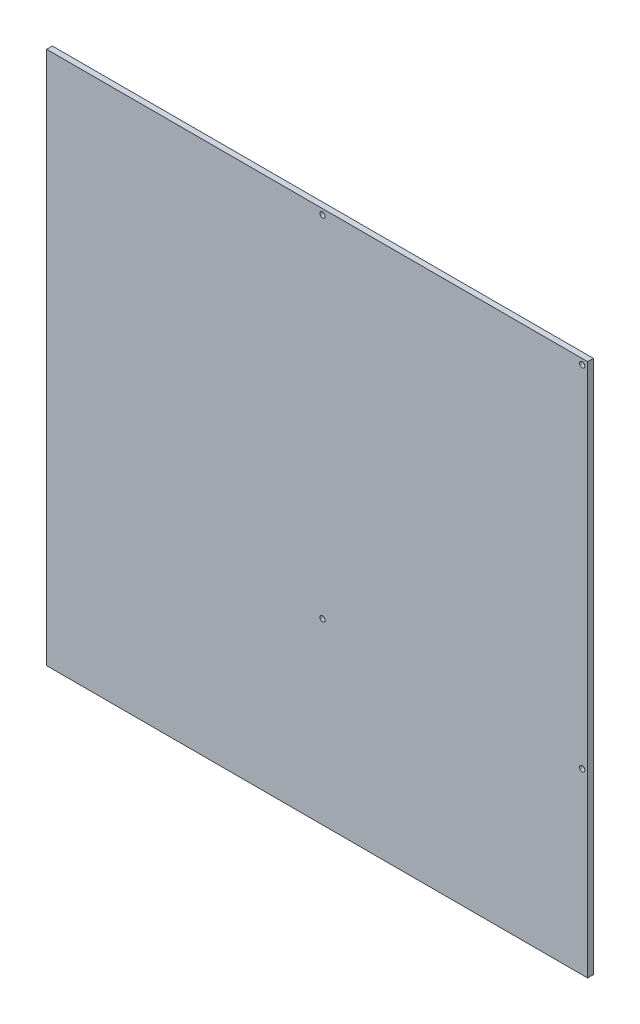
ISO-10303-21;
HEADER;
FILE_DESCRIPTION(('STEP AP214'),'2;1');
FILE_NAME('part.step','',(''),(''),'','','');
FILE_SCHEMA(('AUTOMOTIVE_DESIGN { 1 0 10303 214 1 1 1 1 }'));
ENDSEC;
DATA;
#1=APPLICATION_CONTEXT('core data for automotive mechanical design processes');
#2=APPLICATION_PROTOCOL_DEFINITION('international standard','automotive_design',2000,#1);
#3=PRODUCT_CONTEXT('',#1,'mechanical');
#4=PRODUCT('Part','Part','',(#3));
#5=PRODUCT_RELATED_PRODUCT_CATEGORY('part','',(#4));
#6=PRODUCT_DEFINITION_FORMATION('','',#4);
#7=PRODUCT_DEFINITION_CONTEXT('part definition',#1,'design');
#8=PRODUCT_DEFINITION('design','',#6,#7);
#9=PRODUCT_DEFINITION_SHAPE('','',#8);
#10=(LENGTH_UNIT() NAMED_UNIT(*) SI_UNIT(.MILLI.,.METRE.));
#11=(NAMED_UNIT(*) PLANE_ANGLE_UNIT() SI_UNIT($,.RADIAN.));
#12=(NAMED_UNIT(*) SI_UNIT($,.STERADIAN.) SOLID_ANGLE_UNIT());
#13=UNCERTAINTY_MEASURE_WITH_UNIT(LENGTH_MEASURE(1.E-05),#10,'distance_accuracy_value','');
#14=(GEOMETRIC_REPRESENTATION_CONTEXT(3) GLOBAL_UNCERTAINTY_ASSIGNED_CONTEXT((#13)) GLOBAL_UNIT_ASSIGNED_CONTEXT((#10,
#11,#12)) REPRESENTATION_CONTEXT('',''));
#15=CARTESIAN_POINT('',(0.,0.,0.));
#16=DIRECTION('',(0.,0.,1.));
#17=DIRECTION('',(1.,0.,0.));
#18=AXIS2_PLACEMENT_3D('',#15,#16,#17);
#19=CARTESIAN_POINT('',(-150.,148.,3.18));
#20=DIRECTION('',(1.,0.,0.));
#21=DIRECTION('',(0.,1.,0.));
#22=AXIS2_PLACEMENT_3D('',#19,#20,#21);
#23=PLANE('',#22);
#24=DIRECTION('',(0.,-1.,0.));
#25=VECTOR('',#24,1.);
#26=CARTESIAN_POINT('',(-150.,148.,0.));
#27=LINE('',#26,#25);
#28=CARTESIAN_POINT('',(-150.,148.,0.));
#29=VERTEX_POINT('',#28);
#30=CARTESIAN_POINT('',(-150.,-148.,0.));
#31=VERTEX_POINT('',#30);
#32=EDGE_CURVE('E107',#29,#31,#27,.T.);
#33=ORIENTED_EDGE('',*,*,#32,.T.);
#34=DIRECTION('',(0.,0.,-1.));
#35=VECTOR('',#34,1.);
#36=CARTESIAN_POINT('',(-150.,-148.,3.18));
#37=LINE('',#36,#35);
#38=CARTESIAN_POINT('',(-150.,-148.,3.18));
#39=VERTEX_POINT('',#38);
#40=EDGE_CURVE('E11',#39,#31,#37,.T.);
#41=ORIENTED_EDGE('',*,*,#40,.F.);
#42=DIRECTION('',(0.,-1.,0.));
#43=VECTOR('',#42,1.);
#44=CARTESIAN_POINT('',(-150.,148.,3.18));
#45=LINE('',#44,#43);
#46=CARTESIAN_POINT('',(-150.,148.,3.18));
#47=VERTEX_POINT('',#46);
#48=EDGE_CURVE('E91',#47,#39,#45,.T.);
#49=ORIENTED_EDGE('',*,*,#48,.F.);
#50=DIRECTION('',(0.,0.,-1.));
#51=VECTOR('',#50,1.);
#52=CARTESIAN_POINT('',(-150.,148.,3.18));
#53=LINE('',#52,#51);
#54=EDGE_CURVE('E103',#47,#29,#53,.T.);
#55=ORIENTED_EDGE('',*,*,#54,.T.);
#56=EDGE_LOOP('',(#33,#41,#49,#55));
#57=FACE_BOUND('',#56,.T.);
#58=ADVANCED_FACE('F39',(#57),#23,.F.);
#59=CARTESIAN_POINT('',(150.,-148.,3.18));
#60=DIRECTION('',(0.,1.,0.));
#61=DIRECTION('',(-1.,0.,0.));
#62=AXIS2_PLACEMENT_3D('',#59,#60,#61);
#63=PLANE('',#62);
#64=DIRECTION('',(1.,0.,0.));
#65=VECTOR('',#64,1.);
#66=CARTESIAN_POINT('',(150.,-148.,0.));
#67=LINE('',#66,#65);
#68=CARTESIAN_POINT('',(150.,-148.,0.));
#69=VERTEX_POINT('',#68);
#70=EDGE_CURVE('E96',#31,#69,#67,.T.);
#71=ORIENTED_EDGE('',*,*,#70,.T.);
#72=DIRECTION('',(0.,0.,-1.));
#73=VECTOR('',#72,1.);
#74=CARTESIAN_POINT('',(150.,-148.,3.18));
#75=LINE('',#74,#73);
#76=CARTESIAN_POINT('',(150.,-148.,3.18));
#77=VERTEX_POINT('',#76);
#78=EDGE_CURVE('E48',#77,#69,#75,.T.);
#79=ORIENTED_EDGE('',*,*,#78,.F.);
#80=DIRECTION('',(1.,0.,0.));
#81=VECTOR('',#80,1.);
#82=CARTESIAN_POINT('',(150.,-148.,3.18));
#83=LINE('',#82,#81);
#84=EDGE_CURVE('E86',#39,#77,#83,.T.);
#85=ORIENTED_EDGE('',*,*,#84,.F.);
#86=ORIENTED_EDGE('',*,*,#40,.T.);
#87=EDGE_LOOP('',(#71,#79,#85,#86));
#88=FACE_BOUND('',#87,.T.);
#89=ADVANCED_FACE('F95',(#88),#63,.F.);
#90=CARTESIAN_POINT('',(150.,148.,3.18));
#91=DIRECTION('',(-1.,0.,0.));
#92=DIRECTION('',(0.,-1.,0.));
#93=AXIS2_PLACEMENT_3D('',#90,#91,#92);
#94=PLANE('',#93);
#95=DIRECTION('',(0.,1.,0.));
#96=VECTOR('',#95,1.);
#97=CARTESIAN_POINT('',(150.,148.,0.));
#98=LINE('',#97,#96);
#99=CARTESIAN_POINT('',(150.,148.,0.));
#100=VERTEX_POINT('',#99);
#101=EDGE_CURVE('E73',#69,#100,#98,.T.);
#102=ORIENTED_EDGE('',*,*,#101,.T.);
#103=DIRECTION('',(0.,0.,-1.));
#104=VECTOR('',#103,1.);
#105=CARTESIAN_POINT('',(150.,148.,3.18));
#106=LINE('',#105,#104);
#107=CARTESIAN_POINT('',(150.,148.,3.18));
#108=VERTEX_POINT('',#107);
#109=EDGE_CURVE('E98',#108,#100,#106,.T.);
#110=ORIENTED_EDGE('',*,*,#109,.F.);
#111=DIRECTION('',(0.,1.,0.));
#112=VECTOR('',#111,1.);
#113=CARTESIAN_POINT('',(150.,148.,3.18));
#114=LINE('',#113,#112);
#115=EDGE_CURVE('E89',#77,#108,#114,.T.);
#116=ORIENTED_EDGE('',*,*,#115,.F.);
#117=ORIENTED_EDGE('',*,*,#78,.T.);
#118=EDGE_LOOP('',(#102,#110,#116,#117));
#119=FACE_BOUND('',#118,.T.);
#120=ADVANCED_FACE('F99',(#119),#94,.F.);
#121=CARTESIAN_POINT('',(150.,148.,3.18));
#122=DIRECTION('',(0.,-1.,0.));
#123=DIRECTION('',(1.,0.,0.));
#124=AXIS2_PLACEMENT_3D('',#121,#122,#123);
#125=PLANE('',#124);
#126=DIRECTION('',(-1.,0.,0.));
#127=VECTOR('',#126,1.);
#128=CARTESIAN_POINT('',(150.,148.,0.));
#129=LINE('',#128,#127);
#130=EDGE_CURVE('E79',#100,#29,#129,.T.);
#131=ORIENTED_EDGE('',*,*,#130,.T.);
#132=ORIENTED_EDGE('',*,*,#54,.F.);
#133=DIRECTION('',(-1.,0.,0.));
#134=VECTOR('',#133,1.);
#135=CARTESIAN_POINT('',(150.,148.,3.18));
#136=LINE('',#135,#134);
#137=EDGE_CURVE('E56',#108,#47,#136,.T.);
#138=ORIENTED_EDGE('',*,*,#137,.F.);
#139=ORIENTED_EDGE('',*,*,#109,.T.);
#140=EDGE_LOOP('',(#131,#132,#138,#139));
#141=FACE_BOUND('',#140,.T.);
#142=ADVANCED_FACE('F121',(#141),#125,.F.);
#143=CARTESIAN_POINT('',(0.,0.,3.18));
#144=DIRECTION('',(0.,0.,-1.));
#145=DIRECTION('',(-1.,0.,0.));
#146=AXIS2_PLACEMENT_3D('',#143,#144,#145);
#147=PLANE('',#146);
#148=CARTESIAN_POINT('',(3.00000000000003,145.,3.18));
#149=DIRECTION('',(0.,0.,1.));
#150=DIRECTION('',(1.,0.,0.));
#151=AXIS2_PLACEMENT_3D('',#148,#149,#150);
#152=CIRCLE('',#151,1.47000000000003);
#153=CARTESIAN_POINT('',(4.47000000000006,145.,3.18));
#154=VERTEX_POINT('',#153);
#155=EDGE_CURVE('E136',#154,#154,#152,.T.);
#156=ORIENTED_EDGE('',*,*,#155,.F.);
#157=EDGE_LOOP('',(#156));
#158=FACE_BOUND('',#157,.T.);
#159=CARTESIAN_POINT('',(3.00000000000003,-49.,3.18));
#160=DIRECTION('',(0.,0.,1.));
#161=DIRECTION('',(1.,0.,0.));
#162=AXIS2_PLACEMENT_3D('',#159,#160,#161);
#163=CIRCLE('',#162,1.47000000000002);
#164=CARTESIAN_POINT('',(4.47000000000005,-49.,3.18));
#165=VERTEX_POINT('',#164);
#166=EDGE_CURVE('E144',#165,#165,#163,.T.);
#167=ORIENTED_EDGE('',*,*,#166,.F.);
#168=EDGE_LOOP('',(#167));
#169=FACE_BOUND('',#168,.T.);
#170=CARTESIAN_POINT('',(147.,-49.,3.18));
#171=DIRECTION('',(0.,0.,1.));
#172=DIRECTION('',(1.,0.,0.));
#173=AXIS2_PLACEMENT_3D('',#170,#171,#172);
#174=CIRCLE('',#173,1.46999999999999);
#175=CARTESIAN_POINT('',(148.47,-49.,3.18));
#176=VERTEX_POINT('',#175);
#177=EDGE_CURVE('E152',#176,#176,#174,.T.);
#178=ORIENTED_EDGE('',*,*,#177,.F.);
#179=EDGE_LOOP('',(#178));
#180=FACE_BOUND('',#179,.T.);
#181=CARTESIAN_POINT('',(147.,145.,3.18));
#182=DIRECTION('',(0.,0.,1.));
#183=DIRECTION('',(1.,0.,0.));
#184=AXIS2_PLACEMENT_3D('',#181,#182,#183);
#185=CIRCLE('',#184,1.47);
#186=CARTESIAN_POINT('',(148.47,145.,3.18));
#187=VERTEX_POINT('',#186);
#188=EDGE_CURVE('E128',#187,#187,#185,.T.);
#189=ORIENTED_EDGE('',*,*,#188,.F.);
#190=EDGE_LOOP('',(#189));
#191=FACE_BOUND('',#190,.T.);
#192=ORIENTED_EDGE('',*,*,#48,.T.);
#193=ORIENTED_EDGE('',*,*,#84,.T.);
#194=ORIENTED_EDGE('',*,*,#115,.T.);
#195=ORIENTED_EDGE('',*,*,#137,.T.);
#196=EDGE_LOOP('',(#192,#193,#194,#195));
#197=FACE_BOUND('',#196,.T.);
#198=ADVANCED_FACE('F87',(#158,#169,#180,#191,#197),#147,.F.);
#199=CARTESIAN_POINT('',(0.,0.,0.));
#200=DIRECTION('',(0.,0.,-1.));
#201=DIRECTION('',(-1.,0.,0.));
#202=AXIS2_PLACEMENT_3D('',#199,#200,#201);
#203=PLANE('',#202);
#204=CARTESIAN_POINT('',(3.00000000000003,145.,0.));
#205=DIRECTION('',(0.,0.,1.));
#206=DIRECTION('',(1.,0.,0.));
#207=AXIS2_PLACEMENT_3D('',#204,#205,#206);
#208=CIRCLE('',#207,1.47000000000003);
#209=CARTESIAN_POINT('',(4.47000000000006,145.,0.));
#210=VERTEX_POINT('',#209);
#211=EDGE_CURVE('E140',#210,#210,#208,.T.);
#212=ORIENTED_EDGE('',*,*,#211,.T.);
#213=EDGE_LOOP('',(#212));
#214=FACE_BOUND('',#213,.T.);
#215=CARTESIAN_POINT('',(3.00000000000003,-49.,0.));
#216=DIRECTION('',(0.,0.,1.));
#217=DIRECTION('',(1.,0.,0.));
#218=AXIS2_PLACEMENT_3D('',#215,#216,#217);
#219=CIRCLE('',#218,1.47000000000002);
#220=CARTESIAN_POINT('',(4.47000000000005,-49.,0.));
#221=VERTEX_POINT('',#220);
#222=EDGE_CURVE('E148',#221,#221,#219,.T.);
#223=ORIENTED_EDGE('',*,*,#222,.T.);
#224=EDGE_LOOP('',(#223));
#225=FACE_BOUND('',#224,.T.);
#226=CARTESIAN_POINT('',(147.,-49.,0.));
#227=DIRECTION('',(0.,0.,1.));
#228=DIRECTION('',(1.,0.,0.));
#229=AXIS2_PLACEMENT_3D('',#226,#227,#228);
#230=CIRCLE('',#229,1.46999999999999);
#231=CARTESIAN_POINT('',(148.47,-49.,0.));
#232=VERTEX_POINT('',#231);
#233=EDGE_CURVE('E132',#232,#232,#230,.T.);
#234=ORIENTED_EDGE('',*,*,#233,.T.);
#235=EDGE_LOOP('',(#234));
#236=FACE_BOUND('',#235,.T.);
#237=CARTESIAN_POINT('',(147.,145.,0.));
#238=DIRECTION('',(0.,0.,1.));
#239=DIRECTION('',(1.,0.,0.));
#240=AXIS2_PLACEMENT_3D('',#237,#238,#239);
#241=CIRCLE('',#240,1.47);
#242=CARTESIAN_POINT('',(148.47,145.,0.));
#243=VERTEX_POINT('',#242);
#244=EDGE_CURVE('E111',#243,#243,#241,.T.);
#245=ORIENTED_EDGE('',*,*,#244,.T.);
#246=EDGE_LOOP('',(#245));
#247=FACE_BOUND('',#246,.T.);
#248=ORIENTED_EDGE('',*,*,#32,.F.);
#249=ORIENTED_EDGE('',*,*,#130,.F.);
#250=ORIENTED_EDGE('',*,*,#101,.F.);
#251=ORIENTED_EDGE('',*,*,#70,.F.);
#252=EDGE_LOOP('',(#248,#249,#250,#251));
#253=FACE_BOUND('',#252,.T.);
#254=ADVANCED_FACE('F124',(#214,#225,#236,#247,#253),#203,.T.);
#255=CARTESIAN_POINT('',(147.,145.,0.));
#256=DIRECTION('',(0.,0.,1.));
#257=DIRECTION('',(1.,0.,0.));
#258=AXIS2_PLACEMENT_3D('',#255,#256,#257);
#259=CYLINDRICAL_SURFACE('',#258,1.47);
#260=CARTESIAN_POINT('',(148.47,145.,0.));
#261=CARTESIAN_POINT('',(148.47,145.,0.033125));
#262=CARTESIAN_POINT('',(148.47,145.,0.06625));
#263=CARTESIAN_POINT('',(148.47,145.,0.1325));
#264=CARTESIAN_POINT('',(148.47,145.,0.165625));
#265=CARTESIAN_POINT('',(148.47,145.,0.231875));
#266=CARTESIAN_POINT('',(148.47,145.,0.265));
#267=CARTESIAN_POINT('',(148.47,145.,0.33125));
#268=CARTESIAN_POINT('',(148.47,145.,0.364375));
#269=CARTESIAN_POINT('',(148.47,145.,0.430625));
#270=CARTESIAN_POINT('',(148.47,145.,0.46375));
#271=CARTESIAN_POINT('',(148.47,145.,0.53));
#272=CARTESIAN_POINT('',(148.47,145.,0.563125));
#273=CARTESIAN_POINT('',(148.47,145.,0.629375));
#274=CARTESIAN_POINT('',(148.47,145.,0.6625));
#275=CARTESIAN_POINT('',(148.47,145.,0.72875));
#276=CARTESIAN_POINT('',(148.47,145.,0.761875));
#277=CARTESIAN_POINT('',(148.47,145.,0.828125));
#278=CARTESIAN_POINT('',(148.47,145.,0.86125));
#279=CARTESIAN_POINT('',(148.47,145.,0.9275));
#280=CARTESIAN_POINT('',(148.47,145.,0.960625));
#281=CARTESIAN_POINT('',(148.47,145.,1.026875));
#282=CARTESIAN_POINT('',(148.47,145.,1.06));
#283=CARTESIAN_POINT('',(148.47,145.,1.12625));
#284=CARTESIAN_POINT('',(148.47,145.,1.159375));
#285=CARTESIAN_POINT('',(148.47,145.,1.225625));
#286=CARTESIAN_POINT('',(148.47,145.,1.25875));
#287=CARTESIAN_POINT('',(148.47,145.,1.325));
#288=CARTESIAN_POINT('',(148.47,145.,1.358125));
#289=CARTESIAN_POINT('',(148.47,145.,1.424375));
#290=CARTESIAN_POINT('',(148.47,145.,1.4575));
#291=CARTESIAN_POINT('',(148.47,145.,1.52375));
#292=CARTESIAN_POINT('',(148.47,145.,1.556875));
#293=CARTESIAN_POINT('',(148.47,145.,1.623125));
#294=CARTESIAN_POINT('',(148.47,145.,1.65625));
#295=CARTESIAN_POINT('',(148.47,145.,1.7225));
#296=CARTESIAN_POINT('',(148.47,145.,1.755625));
#297=CARTESIAN_POINT('',(148.47,145.,1.821875));
#298=CARTESIAN_POINT('',(148.47,145.,1.855));
#299=CARTESIAN_POINT('',(148.47,145.,1.92125));
#300=CARTESIAN_POINT('',(148.47,145.,1.954375));
#301=CARTESIAN_POINT('',(148.47,145.,2.020625));
#302=CARTESIAN_POINT('',(148.47,145.,2.05375));
#303=CARTESIAN_POINT('',(148.47,145.,2.12));
#304=CARTESIAN_POINT('',(148.47,145.,2.153125));
#305=CARTESIAN_POINT('',(148.47,145.,2.219375));
#306=CARTESIAN_POINT('',(148.47,145.,2.2525));
#307=CARTESIAN_POINT('',(148.47,145.,2.31875));
#308=CARTESIAN_POINT('',(148.47,145.,2.351875));
#309=CARTESIAN_POINT('',(148.47,145.,2.418125));
#310=CARTESIAN_POINT('',(148.47,145.,2.45125));
#311=CARTESIAN_POINT('',(148.47,145.,2.5175));
#312=CARTESIAN_POINT('',(148.47,145.,2.550625));
#313=CARTESIAN_POINT('',(148.47,145.,2.616875));
#314=CARTESIAN_POINT('',(148.47,145.,2.65));
#315=CARTESIAN_POINT('',(148.47,145.,2.71625));
#316=CARTESIAN_POINT('',(148.47,145.,2.749375));
#317=CARTESIAN_POINT('',(148.47,145.,2.815625));
#318=CARTESIAN_POINT('',(148.47,145.,2.84875));
#319=CARTESIAN_POINT('',(148.47,145.,2.915));
#320=CARTESIAN_POINT('',(148.47,145.,2.948125));
#321=CARTESIAN_POINT('',(148.47,145.,3.014375));
#322=CARTESIAN_POINT('',(148.47,145.,3.0475));
#323=CARTESIAN_POINT('',(148.47,145.,3.11375));
#324=CARTESIAN_POINT('',(148.47,145.,3.146875));
#325=CARTESIAN_POINT('',(148.47,145.,3.18));
#326=B_SPLINE_CURVE_WITH_KNOTS('',3,(#260,#261,#262,#263,#264,#265,#266,#267,#268,#269,#270,
#271,#272,#273,#274,#275,#276,#277,#278,#279,#280,#281,#282,#283,#284,#285,#286,#287,#288,#289,
#290,#291,#292,#293,#294,#295,#296,#297,#298,#299,#300,#301,#302,#303,#304,#305,#306,#307,#308,
#309,#310,#311,#312,#313,#314,#315,#316,#317,#318,#319,#320,#321,#322,#323,#324,#325),
.UNSPECIFIED.,.F.,.F.,(4,2,2,2,2,2,2,2,2,2,2,2,2,2,2,2,2,2,2,2,2,2,2,2,2,2,2,2,2,2,2,2,4),(0.,
0.099375,0.19875,0.298125,0.3975,0.496875,0.59625,0.695625,0.795,0.894375,0.99375,1.093125,
1.1925,1.291875,1.39125,1.490625,1.59,1.689375,1.78875,1.888125,1.9875,2.086875,2.18625,
2.285625,2.385,2.484375,2.58375,2.683125,2.7825,2.881875,2.98125,3.080625,3.18),.UNSPECIFIED.);
#327=EDGE_CURVE('BSEAM166',#243,#187,#326,.T.);
#328=ORIENTED_EDGE('',*,*,#244,.F.);
#329=ORIENTED_EDGE('',*,*,#188,.T.);
#330=ORIENTED_EDGE('',*,*,#327,.T.);
#331=ORIENTED_EDGE('',*,*,#327,.F.);
#332=EDGE_LOOP('',(#328,#330,#329,#331));
#333=FACE_BOUND('',#332,.T.);
#334=ADVANCED_FACE('F166',(#333),#259,.F.);
#335=CARTESIAN_POINT('',(147.,-49.,0.));
#336=DIRECTION('',(0.,0.,1.));
#337=DIRECTION('',(1.,0.,0.));
#338=AXIS2_PLACEMENT_3D('',#335,#336,#337);
#339=CYLINDRICAL_SURFACE('',#338,1.46999999999999);
#340=CARTESIAN_POINT('',(148.47,-49.,0.));
#341=CARTESIAN_POINT('',(148.47,-49.,0.033125));
#342=CARTESIAN_POINT('',(148.47,-49.,0.06625));
#343=CARTESIAN_POINT('',(148.47,-49.,0.1325));
#344=CARTESIAN_POINT('',(148.47,-49.,0.165625));
#345=CARTESIAN_POINT('',(148.47,-49.,0.231875));
#346=CARTESIAN_POINT('',(148.47,-49.,0.265));
#347=CARTESIAN_POINT('',(148.47,-49.,0.33125));
#348=CARTESIAN_POINT('',(148.47,-49.,0.364375));
#349=CARTESIAN_POINT('',(148.47,-49.,0.430625));
#350=CARTESIAN_POINT('',(148.47,-49.,0.46375));
#351=CARTESIAN_POINT('',(148.47,-49.,0.53));
#352=CARTESIAN_POINT('',(148.47,-49.,0.563125));
#353=CARTESIAN_POINT('',(148.47,-49.,0.629375));
#354=CARTESIAN_POINT('',(148.47,-49.,0.6625));
#355=CARTESIAN_POINT('',(148.47,-49.,0.72875));
#356=CARTESIAN_POINT('',(148.47,-49.,0.761875));
#357=CARTESIAN_POINT('',(148.47,-49.,0.828125));
#358=CARTESIAN_POINT('',(148.47,-49.,0.86125));
#359=CARTESIAN_POINT('',(148.47,-49.,0.9275));
#360=CARTESIAN_POINT('',(148.47,-49.,0.960625));
#361=CARTESIAN_POINT('',(148.47,-49.,1.026875));
#362=CARTESIAN_POINT('',(148.47,-49.,1.06));
#363=CARTESIAN_POINT('',(148.47,-49.,1.12625));
#364=CARTESIAN_POINT('',(148.47,-49.,1.159375));
#365=CARTESIAN_POINT('',(148.47,-49.,1.225625));
#366=CARTESIAN_POINT('',(148.47,-49.,1.25875));
#367=CARTESIAN_POINT('',(148.47,-49.,1.325));
#368=CARTESIAN_POINT('',(148.47,-49.,1.358125));
#369=CARTESIAN_POINT('',(148.47,-49.,1.424375));
#370=CARTESIAN_POINT('',(148.47,-49.,1.4575));
#371=CARTESIAN_POINT('',(148.47,-49.,1.52375));
#372=CARTESIAN_POINT('',(148.47,-49.,1.556875));
#373=CARTESIAN_POINT('',(148.47,-49.,1.623125));
#374=CARTESIAN_POINT('',(148.47,-49.,1.65625));
#375=CARTESIAN_POINT('',(148.47,-49.,1.7225));
#376=CARTESIAN_POINT('',(148.47,-49.,1.755625));
#377=CARTESIAN_POINT('',(148.47,-49.,1.821875));
#378=CARTESIAN_POINT('',(148.47,-49.,1.855));
#379=CARTESIAN_POINT('',(148.47,-49.,1.92125));
#380=CARTESIAN_POINT('',(148.47,-49.,1.954375));
#381=CARTESIAN_POINT('',(148.47,-49.,2.020625));
#382=CARTESIAN_POINT('',(148.47,-49.,2.05375));
#383=CARTESIAN_POINT('',(148.47,-49.,2.12));
#384=CARTESIAN_POINT('',(148.47,-49.,2.153125));
#385=CARTESIAN_POINT('',(148.47,-49.,2.219375));
#386=CARTESIAN_POINT('',(148.47,-49.,2.2525));
#387=CARTESIAN_POINT('',(148.47,-49.,2.31875));
#388=CARTESIAN_POINT('',(148.47,-49.,2.351875));
#389=CARTESIAN_POINT('',(148.47,-49.,2.418125));
#390=CARTESIAN_POINT('',(148.47,-49.,2.45125));
#391=CARTESIAN_POINT('',(148.47,-49.,2.5175));
#392=CARTESIAN_POINT('',(148.47,-49.,2.550625));
#393=CARTESIAN_POINT('',(148.47,-49.,2.616875));
#394=CARTESIAN_POINT('',(148.47,-49.,2.65));
#395=CARTESIAN_POINT('',(148.47,-49.,2.71625));
#396=CARTESIAN_POINT('',(148.47,-49.,2.749375));
#397=CARTESIAN_POINT('',(148.47,-49.,2.815625));
#398=CARTESIAN_POINT('',(148.47,-49.,2.84875));
#399=CARTESIAN_POINT('',(148.47,-49.,2.915));
#400=CARTESIAN_POINT('',(148.47,-49.,2.948125));
#401=CARTESIAN_POINT('',(148.47,-49.,3.014375));
#402=CARTESIAN_POINT('',(148.47,-49.,3.0475));
#403=CARTESIAN_POINT('',(148.47,-49.,3.11375));
#404=CARTESIAN_POINT('',(148.47,-49.,3.146875));
#405=CARTESIAN_POINT('',(148.47,-49.,3.18));
#406=B_SPLINE_CURVE_WITH_KNOTS('',3,(#340,#341,#342,#343,#344,#345,#346,#347,#348,#349,#350,
#351,#352,#353,#354,#355,#356,#357,#358,#359,#360,#361,#362,#363,#364,#365,#366,#367,#368,#369,
#370,#371,#372,#373,#374,#375,#376,#377,#378,#379,#380,#381,#382,#383,#384,#385,#386,#387,#388,
#389,#390,#391,#392,#393,#394,#395,#396,#397,#398,#399,#400,#401,#402,#403,#404,#405),
.UNSPECIFIED.,.F.,.F.,(4,2,2,2,2,2,2,2,2,2,2,2,2,2,2,2,2,2,2,2,2,2,2,2,2,2,2,2,2,2,2,2,4),(0.,
0.099375,0.19875,0.298125,0.3975,0.496875,0.59625,0.695625,0.795,0.894375,0.99375,1.093125,
1.1925,1.291875,1.39125,1.490625,1.59,1.689375,1.78875,1.888125,1.9875,2.086875,2.18625,
2.285625,2.385,2.484375,2.58375,2.683125,2.7825,2.881875,2.98125,3.080625,3.18),.UNSPECIFIED.);
#407=EDGE_CURVE('BSEAM162',#232,#176,#406,.T.);
#408=ORIENTED_EDGE('',*,*,#233,.F.);
#409=ORIENTED_EDGE('',*,*,#177,.T.);
#410=ORIENTED_EDGE('',*,*,#407,.T.);
#411=ORIENTED_EDGE('',*,*,#407,.F.);
#412=EDGE_LOOP('',(#408,#410,#409,#411));
#413=FACE_BOUND('',#412,.T.);
#414=ADVANCED_FACE('F162',(#413),#339,.F.);
#415=CARTESIAN_POINT('',(3.00000000000003,-49.,0.));
#416=DIRECTION('',(0.,0.,1.));
#417=DIRECTION('',(1.,0.,0.));
#418=AXIS2_PLACEMENT_3D('',#415,#416,#417);
#419=CYLINDRICAL_SURFACE('',#418,1.47000000000002);
#420=CARTESIAN_POINT('',(4.47000000000005,-49.,0.));
#421=CARTESIAN_POINT('',(4.47000000000005,-49.,0.033125));
#422=CARTESIAN_POINT('',(4.47000000000005,-49.,0.06625));
#423=CARTESIAN_POINT('',(4.47000000000005,-49.,0.1325));
#424=CARTESIAN_POINT('',(4.47000000000005,-49.,0.165625));
#425=CARTESIAN_POINT('',(4.47000000000005,-49.,0.231875));
#426=CARTESIAN_POINT('',(4.47000000000005,-49.,0.265));
#427=CARTESIAN_POINT('',(4.47000000000005,-49.,0.33125));
#428=CARTESIAN_POINT('',(4.47000000000005,-49.,0.364375));
#429=CARTESIAN_POINT('',(4.47000000000005,-49.,0.430625));
#430=CARTESIAN_POINT('',(4.47000000000005,-49.,0.46375));
#431=CARTESIAN_POINT('',(4.47000000000005,-49.,0.53));
#432=CARTESIAN_POINT('',(4.47000000000005,-49.,0.563125));
#433=CARTESIAN_POINT('',(4.47000000000005,-49.,0.629375));
#434=CARTESIAN_POINT('',(4.47000000000005,-49.,0.6625));
#435=CARTESIAN_POINT('',(4.47000000000005,-49.,0.72875));
#436=CARTESIAN_POINT('',(4.47000000000005,-49.,0.761875));
#437=CARTESIAN_POINT('',(4.47000000000005,-49.,0.828125));
#438=CARTESIAN_POINT('',(4.47000000000005,-49.,0.86125));
#439=CARTESIAN_POINT('',(4.47000000000005,-49.,0.9275));
#440=CARTESIAN_POINT('',(4.47000000000005,-49.,0.960625));
#441=CARTESIAN_POINT('',(4.47000000000005,-49.,1.026875));
#442=CARTESIAN_POINT('',(4.47000000000005,-49.,1.06));
#443=CARTESIAN_POINT('',(4.47000000000005,-49.,1.12625));
#444=CARTESIAN_POINT('',(4.47000000000005,-49.,1.159375));
#445=CARTESIAN_POINT('',(4.47000000000005,-49.,1.225625));
#446=CARTESIAN_POINT('',(4.47000000000005,-49.,1.25875));
#447=CARTESIAN_POINT('',(4.47000000000005,-49.,1.325));
#448=CARTESIAN_POINT('',(4.47000000000005,-49.,1.358125));
#449=CARTESIAN_POINT('',(4.47000000000005,-49.,1.424375));
#450=CARTESIAN_POINT('',(4.47000000000005,-49.,1.4575));
#451=CARTESIAN_POINT('',(4.47000000000005,-49.,1.52375));
#452=CARTESIAN_POINT('',(4.47000000000005,-49.,1.556875));
#453=CARTESIAN_POINT('',(4.47000000000005,-49.,1.623125));
#454=CARTESIAN_POINT('',(4.47000000000005,-49.,1.65625));
#455=CARTESIAN_POINT('',(4.47000000000005,-49.,1.7225));
#456=CARTESIAN_POINT('',(4.47000000000005,-49.,1.755625));
#457=CARTESIAN_POINT('',(4.47000000000005,-49.,1.821875));
#458=CARTESIAN_POINT('',(4.47000000000005,-49.,1.855));
#459=CARTESIAN_POINT('',(4.47000000000005,-49.,1.92125));
#460=CARTESIAN_POINT('',(4.47000000000005,-49.,1.954375));
#461=CARTESIAN_POINT('',(4.47000000000005,-49.,2.020625));
#462=CARTESIAN_POINT('',(4.47000000000005,-49.,2.05375));
#463=CARTESIAN_POINT('',(4.47000000000005,-49.,2.12));
#464=CARTESIAN_POINT('',(4.47000000000005,-49.,2.153125));
#465=CARTESIAN_POINT('',(4.47000000000005,-49.,2.219375));
#466=CARTESIAN_POINT('',(4.47000000000005,-49.,2.2525));
#467=CARTESIAN_POINT('',(4.47000000000005,-49.,2.31875));
#468=CARTESIAN_POINT('',(4.47000000000005,-49.,2.351875));
#469=CARTESIAN_POINT('',(4.47000000000005,-49.,2.418125));
#470=CARTESIAN_POINT('',(4.47000000000005,-49.,2.45125));
#471=CARTESIAN_POINT('',(4.47000000000005,-49.,2.5175));
#472=CARTESIAN_POINT('',(4.47000000000005,-49.,2.550625));
#473=CARTESIAN_POINT('',(4.47000000000005,-49.,2.616875));
#474=CARTESIAN_POINT('',(4.47000000000005,-49.,2.65));
#475=CARTESIAN_POINT('',(4.47000000000005,-49.,2.71625));
#476=CARTESIAN_POINT('',(4.47000000000005,-49.,2.749375));
#477=CARTESIAN_POINT('',(4.47000000000005,-49.,2.815625));
#478=CARTESIAN_POINT('',(4.47000000000005,-49.,2.84875));
#479=CARTESIAN_POINT('',(4.47000000000005,-49.,2.915));
#480=CARTESIAN_POINT('',(4.47000000000005,-49.,2.948125));
#481=CARTESIAN_POINT('',(4.47000000000005,-49.,3.014375));
#482=CARTESIAN_POINT('',(4.47000000000005,-49.,3.0475));
#483=CARTESIAN_POINT('',(4.47000000000005,-49.,3.11375));
#484=CARTESIAN_POINT('',(4.47000000000005,-49.,3.146875));
#485=CARTESIAN_POINT('',(4.47000000000005,-49.,3.18));
#486=B_SPLINE_CURVE_WITH_KNOTS('',3,(#420,#421,#422,#423,#424,#425,#426,#427,#428,#429,#430,
#431,#432,#433,#434,#435,#436,#437,#438,#439,#440,#441,#442,#443,#444,#445,#446,#447,#448,#449,
#450,#451,#452,#453,#454,#455,#456,#457,#458,#459,#460,#461,#462,#463,#464,#465,#466,#467,#468,
#469,#470,#471,#472,#473,#474,#475,#476,#477,#478,#479,#480,#481,#482,#483,#484,#485),
.UNSPECIFIED.,.F.,.F.,(4,2,2,2,2,2,2,2,2,2,2,2,2,2,2,2,2,2,2,2,2,2,2,2,2,2,2,2,2,2,2,2,4),(0.,
0.099375,0.19875,0.298125,0.3975,0.496875,0.59625,0.695625,0.795,0.894375,0.99375,1.093125,
1.1925,1.291875,1.39125,1.490625,1.59,1.689375,1.78875,1.888125,1.9875,2.086875,2.18625,
2.285625,2.385,2.484375,2.58375,2.683125,2.7825,2.881875,2.98125,3.080625,3.18),.UNSPECIFIED.);
#487=EDGE_CURVE('BSEAM165',#221,#165,#486,.T.);
#488=ORIENTED_EDGE('',*,*,#222,.F.);
#489=ORIENTED_EDGE('',*,*,#166,.T.);
#490=ORIENTED_EDGE('',*,*,#487,.T.);
#491=ORIENTED_EDGE('',*,*,#487,.F.);
#492=EDGE_LOOP('',(#488,#490,#489,#491));
#493=FACE_BOUND('',#492,.T.);
#494=ADVANCED_FACE('F165',(#493),#419,.F.);
#495=CARTESIAN_POINT('',(3.00000000000003,145.,0.));
#496=DIRECTION('',(0.,0.,1.));
#497=DIRECTION('',(1.,0.,0.));
#498=AXIS2_PLACEMENT_3D('',#495,#496,#497);
#499=CYLINDRICAL_SURFACE('',#498,1.47000000000003);
#500=CARTESIAN_POINT('',(4.47000000000006,145.,0.));
#501=CARTESIAN_POINT('',(4.47000000000006,145.,0.033125));
#502=CARTESIAN_POINT('',(4.47000000000006,145.,0.06625));
#503=CARTESIAN_POINT('',(4.47000000000006,145.,0.1325));
#504=CARTESIAN_POINT('',(4.47000000000006,145.,0.165625));
#505=CARTESIAN_POINT('',(4.47000000000006,145.,0.231875));
#506=CARTESIAN_POINT('',(4.47000000000006,145.,0.265));
#507=CARTESIAN_POINT('',(4.47000000000006,145.,0.33125));
#508=CARTESIAN_POINT('',(4.47000000000006,145.,0.364375));
#509=CARTESIAN_POINT('',(4.47000000000006,145.,0.430625));
#510=CARTESIAN_POINT('',(4.47000000000006,145.,0.46375));
#511=CARTESIAN_POINT('',(4.47000000000006,145.,0.53));
#512=CARTESIAN_POINT('',(4.47000000000006,145.,0.563125));
#513=CARTESIAN_POINT('',(4.47000000000006,145.,0.629375));
#514=CARTESIAN_POINT('',(4.47000000000006,145.,0.6625));
#515=CARTESIAN_POINT('',(4.47000000000006,145.,0.72875));
#516=CARTESIAN_POINT('',(4.47000000000006,145.,0.761875));
#517=CARTESIAN_POINT('',(4.47000000000006,145.,0.828125));
#518=CARTESIAN_POINT('',(4.47000000000006,145.,0.86125));
#519=CARTESIAN_POINT('',(4.47000000000006,145.,0.9275));
#520=CARTESIAN_POINT('',(4.47000000000006,145.,0.960625));
#521=CARTESIAN_POINT('',(4.47000000000006,145.,1.026875));
#522=CARTESIAN_POINT('',(4.47000000000006,145.,1.06));
#523=CARTESIAN_POINT('',(4.47000000000006,145.,1.12625));
#524=CARTESIAN_POINT('',(4.47000000000006,145.,1.159375));
#525=CARTESIAN_POINT('',(4.47000000000006,145.,1.225625));
#526=CARTESIAN_POINT('',(4.47000000000006,145.,1.25875));
#527=CARTESIAN_POINT('',(4.47000000000006,145.,1.325));
#528=CARTESIAN_POINT('',(4.47000000000006,145.,1.358125));
#529=CARTESIAN_POINT('',(4.47000000000006,145.,1.424375));
#530=CARTESIAN_POINT('',(4.47000000000006,145.,1.4575));
#531=CARTESIAN_POINT('',(4.47000000000006,145.,1.52375));
#532=CARTESIAN_POINT('',(4.47000000000006,145.,1.556875));
#533=CARTESIAN_POINT('',(4.47000000000006,145.,1.623125));
#534=CARTESIAN_POINT('',(4.47000000000006,145.,1.65625));
#535=CARTESIAN_POINT('',(4.47000000000006,145.,1.7225));
#536=CARTESIAN_POINT('',(4.47000000000006,145.,1.755625));
#537=CARTESIAN_POINT('',(4.47000000000006,145.,1.821875));
#538=CARTESIAN_POINT('',(4.47000000000006,145.,1.855));
#539=CARTESIAN_POINT('',(4.47000000000006,145.,1.92125));
#540=CARTESIAN_POINT('',(4.47000000000006,145.,1.954375));
#541=CARTESIAN_POINT('',(4.47000000000006,145.,2.020625));
#542=CARTESIAN_POINT('',(4.47000000000006,145.,2.05375));
#543=CARTESIAN_POINT('',(4.47000000000006,145.,2.12));
#544=CARTESIAN_POINT('',(4.47000000000006,145.,2.153125));
#545=CARTESIAN_POINT('',(4.47000000000006,145.,2.219375));
#546=CARTESIAN_POINT('',(4.47000000000006,145.,2.2525));
#547=CARTESIAN_POINT('',(4.47000000000006,145.,2.31875));
#548=CARTESIAN_POINT('',(4.47000000000006,145.,2.351875));
#549=CARTESIAN_POINT('',(4.47000000000006,145.,2.418125));
#550=CARTESIAN_POINT('',(4.47000000000006,145.,2.45125));
#551=CARTESIAN_POINT('',(4.47000000000006,145.,2.5175));
#552=CARTESIAN_POINT('',(4.47000000000006,145.,2.550625));
#553=CARTESIAN_POINT('',(4.47000000000006,145.,2.616875));
#554=CARTESIAN_POINT('',(4.47000000000006,145.,2.65));
#555=CARTESIAN_POINT('',(4.47000000000006,145.,2.71625));
#556=CARTESIAN_POINT('',(4.47000000000006,145.,2.749375));
#557=CARTESIAN_POINT('',(4.47000000000006,145.,2.815625));
#558=CARTESIAN_POINT('',(4.47000000000006,145.,2.84875));
#559=CARTESIAN_POINT('',(4.47000000000006,145.,2.915));
#560=CARTESIAN_POINT('',(4.47000000000006,145.,2.948125));
#561=CARTESIAN_POINT('',(4.47000000000006,145.,3.014375));
#562=CARTESIAN_POINT('',(4.47000000000006,145.,3.0475));
#563=CARTESIAN_POINT('',(4.47000000000006,145.,3.11375));
#564=CARTESIAN_POINT('',(4.47000000000006,145.,3.146875));
#565=CARTESIAN_POINT('',(4.47000000000006,145.,3.18));
#566=B_SPLINE_CURVE_WITH_KNOTS('',3,(#500,#501,#502,#503,#504,#505,#506,#507,#508,#509,#510,
#511,#512,#513,#514,#515,#516,#517,#518,#519,#520,#521,#522,#523,#524,#525,#526,#527,#528,#529,
#530,#531,#532,#533,#534,#535,#536,#537,#538,#539,#540,#541,#542,#543,#544,#545,#546,#547,#548,
#549,#550,#551,#552,#553,#554,#555,#556,#557,#558,#559,#560,#561,#562,#563,#564,#565),
.UNSPECIFIED.,.F.,.F.,(4,2,2,2,2,2,2,2,2,2,2,2,2,2,2,2,2,2,2,2,2,2,2,2,2,2,2,2,2,2,2,2,4),(0.,
0.099375,0.19875,0.298125,0.3975,0.496875,0.59625,0.695625,0.795,0.894375,0.99375,1.093125,
1.1925,1.291875,1.39125,1.490625,1.59,1.689375,1.78875,1.888125,1.9875,2.086875,2.18625,
2.285625,2.385,2.484375,2.58375,2.683125,2.7825,2.881875,2.98125,3.080625,3.18),.UNSPECIFIED.);
#567=EDGE_CURVE('BSEAM227',#210,#154,#566,.T.);
#568=ORIENTED_EDGE('',*,*,#211,.F.);
#569=ORIENTED_EDGE('',*,*,#155,.T.);
#570=ORIENTED_EDGE('',*,*,#567,.T.);
#571=ORIENTED_EDGE('',*,*,#567,.F.);
#572=EDGE_LOOP('',(#568,#570,#569,#571));
#573=FACE_BOUND('',#572,.T.);
#574=ADVANCED_FACE('F227',(#573),#499,.F.);
#575=CLOSED_SHELL('',(#58,#89,#120,#142,#198,#254,#334,#414,#494,#574));
#576=MANIFOLD_SOLID_BREP('B2',#575);
#577=ADVANCED_BREP_SHAPE_REPRESENTATION('',(#18,#576),#14);
#578=SHAPE_DEFINITION_REPRESENTATION(#9,#577);
ENDSEC;
END-ISO-10303-21;
